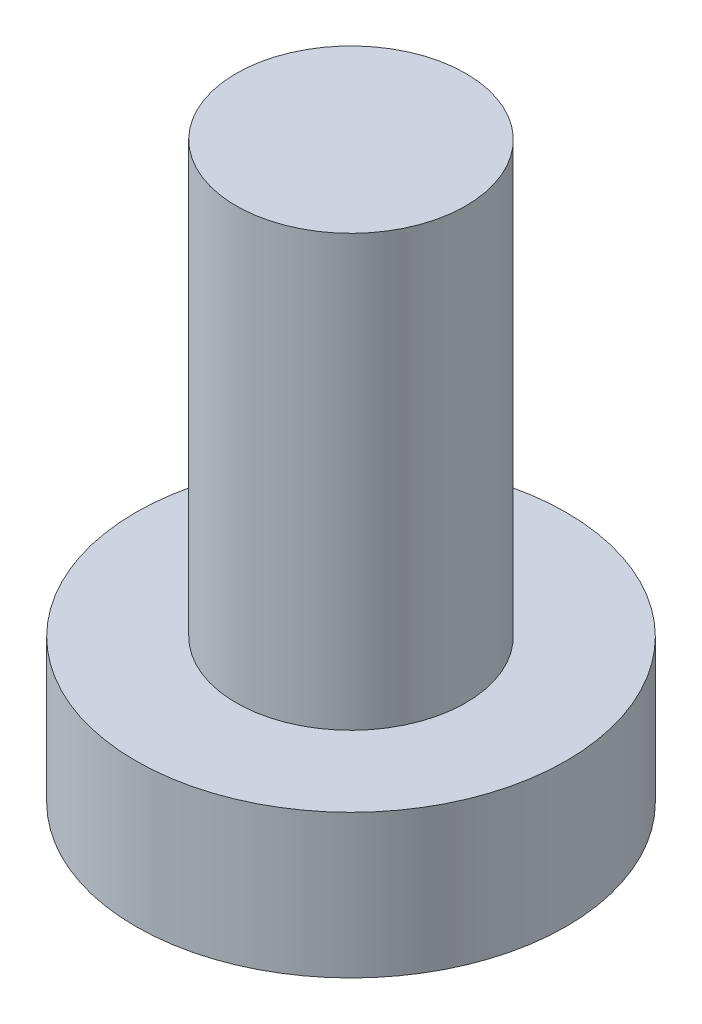
ISO-10303-21;
HEADER;
FILE_DESCRIPTION(('STEP AP214'),'2;1');
FILE_NAME('part.step','',(''),(''),'','','');
FILE_SCHEMA(('AUTOMOTIVE_DESIGN { 1 0 10303 214 1 1 1 1 }'));
ENDSEC;
DATA;
#1=APPLICATION_CONTEXT('core data for automotive mechanical design processes');
#2=APPLICATION_PROTOCOL_DEFINITION('international standard','automotive_design',2000,#1);
#3=PRODUCT_CONTEXT('',#1,'mechanical');
#4=PRODUCT('Part','Part','',(#3));
#5=PRODUCT_RELATED_PRODUCT_CATEGORY('part','',(#4));
#6=PRODUCT_DEFINITION_FORMATION('','',#4);
#7=PRODUCT_DEFINITION_CONTEXT('part definition',#1,'design');
#8=PRODUCT_DEFINITION('design','',#6,#7);
#9=PRODUCT_DEFINITION_SHAPE('','',#8);
#10=(LENGTH_UNIT() NAMED_UNIT(*) SI_UNIT(.MILLI.,.METRE.));
#11=(NAMED_UNIT(*) PLANE_ANGLE_UNIT() SI_UNIT($,.RADIAN.));
#12=(NAMED_UNIT(*) SI_UNIT($,.STERADIAN.) SOLID_ANGLE_UNIT());
#13=UNCERTAINTY_MEASURE_WITH_UNIT(LENGTH_MEASURE(1.E-05),#10,'distance_accuracy_value','');
#14=(GEOMETRIC_REPRESENTATION_CONTEXT(3) GLOBAL_UNCERTAINTY_ASSIGNED_CONTEXT((#13)) GLOBAL_UNIT_ASSIGNED_CONTEXT((#10,
#11,#12)) REPRESENTATION_CONTEXT('',''));
#15=CARTESIAN_POINT('',(0.,0.,0.));
#16=DIRECTION('',(0.,0.,1.));
#17=DIRECTION('',(1.,0.,0.));
#18=AXIS2_PLACEMENT_3D('',#15,#16,#17);
#19=CARTESIAN_POINT('',(7.5,0.,0.));
#20=DIRECTION('',(0.,-1.,0.));
#21=DIRECTION('',(0.,0.,-1.));
#22=AXIS2_PLACEMENT_3D('',#19,#20,#21);
#23=PLANE('',#22);
#24=CARTESIAN_POINT('',(0.,0.,0.));
#25=DIRECTION('',(0.,-1.,0.));
#26=DIRECTION('',(0.,0.,-1.));
#27=AXIS2_PLACEMENT_3D('',#24,#25,#26);
#28=CIRCLE('',#27,7.5);
#29=CARTESIAN_POINT('',(0.,0.,-7.5));
#30=VERTEX_POINT('',#29);
#31=EDGE_CURVE('E47',#30,#30,#28,.T.);
#32=ORIENTED_EDGE('',*,*,#31,.T.);
#33=EDGE_LOOP('',(#32));
#34=FACE_BOUND('',#33,.T.);
#35=ADVANCED_FACE('F33',(#34),#23,.T.);
#36=CARTESIAN_POINT('',(0.,20.,0.));
#37=DIRECTION('',(0.,1.,0.));
#38=DIRECTION('',(0.,0.,1.));
#39=AXIS2_PLACEMENT_3D('',#36,#37,#38);
#40=PLANE('',#39);
#41=CARTESIAN_POINT('',(0.,20.,0.));
#42=DIRECTION('',(0.,-1.,0.));
#43=DIRECTION('',(0.,0.,-1.));
#44=AXIS2_PLACEMENT_3D('',#41,#42,#43);
#45=CIRCLE('',#44,4.);
#46=CARTESIAN_POINT('',(0.,20.,-4.));
#47=VERTEX_POINT('',#46);
#48=EDGE_CURVE('E10',#47,#47,#45,.T.);
#49=ORIENTED_EDGE('',*,*,#48,.F.);
#50=EDGE_LOOP('',(#49));
#51=FACE_BOUND('',#50,.T.);
#52=ADVANCED_FACE('F65',(#51),#40,.T.);
#53=CARTESIAN_POINT('',(0.,0.,0.));
#54=DIRECTION('',(0.,-1.,0.));
#55=DIRECTION('',(0.,0.,-1.));
#56=AXIS2_PLACEMENT_3D('',#53,#54,#55);
#57=CYLINDRICAL_SURFACE('',#56,4.);
#58=ORIENTED_EDGE('',*,*,#48,.T.);
#59=EDGE_LOOP('',(#58));
#60=FACE_BOUND('',#59,.T.);
#61=CARTESIAN_POINT('',(0.,5.,0.));
#62=DIRECTION('',(0.,-1.,0.));
#63=DIRECTION('',(0.,0.,-1.));
#64=AXIS2_PLACEMENT_3D('',#61,#62,#63);
#65=CIRCLE('',#64,4.);
#66=CARTESIAN_POINT('',(0.,5.,-4.));
#67=VERTEX_POINT('',#66);
#68=EDGE_CURVE('E39',#67,#67,#65,.T.);
#69=ORIENTED_EDGE('',*,*,#68,.F.);
#70=EDGE_LOOP('',(#69));
#71=FACE_BOUND('',#70,.T.);
#72=ADVANCED_FACE('F62',(#60,#71),#57,.T.);
#73=CARTESIAN_POINT('',(4.,5.,0.));
#74=DIRECTION('',(0.,1.,0.));
#75=DIRECTION('',(0.,0.,1.));
#76=AXIS2_PLACEMENT_3D('',#73,#74,#75);
#77=PLANE('',#76);
#78=ORIENTED_EDGE('',*,*,#68,.T.);
#79=EDGE_LOOP('',(#78));
#80=FACE_BOUND('',#79,.T.);
#81=CARTESIAN_POINT('',(0.,5.,0.));
#82=DIRECTION('',(0.,-1.,0.));
#83=DIRECTION('',(0.,0.,-1.));
#84=AXIS2_PLACEMENT_3D('',#81,#82,#83);
#85=CIRCLE('',#84,7.5);
#86=CARTESIAN_POINT('',(0.,5.,-7.5));
#87=VERTEX_POINT('',#86);
#88=EDGE_CURVE('E43',#87,#87,#85,.T.);
#89=ORIENTED_EDGE('',*,*,#88,.F.);
#90=EDGE_LOOP('',(#89));
#91=FACE_BOUND('',#90,.T.);
#92=ADVANCED_FACE('F56',(#80,#91),#77,.T.);
#93=CARTESIAN_POINT('',(0.,0.,0.));
#94=DIRECTION('',(0.,-1.,0.));
#95=DIRECTION('',(0.,0.,-1.));
#96=AXIS2_PLACEMENT_3D('',#93,#94,#95);
#97=CYLINDRICAL_SURFACE('',#96,7.5);
#98=ORIENTED_EDGE('',*,*,#88,.T.);
#99=EDGE_LOOP('',(#98));
#100=FACE_BOUND('',#99,.T.);
#101=ORIENTED_EDGE('',*,*,#31,.F.);
#102=EDGE_LOOP('',(#101));
#103=FACE_BOUND('',#102,.T.);
#104=ADVANCED_FACE('F54',(#100,#103),#97,.T.);
#105=CLOSED_SHELL('',(#35,#52,#72,#92,#104));
#106=MANIFOLD_SOLID_BREP('B2',#105);
#107=ADVANCED_BREP_SHAPE_REPRESENTATION('',(#18,#106),#14);
#108=SHAPE_DEFINITION_REPRESENTATION(#9,#107);
ENDSEC;
END-ISO-10303-21;
